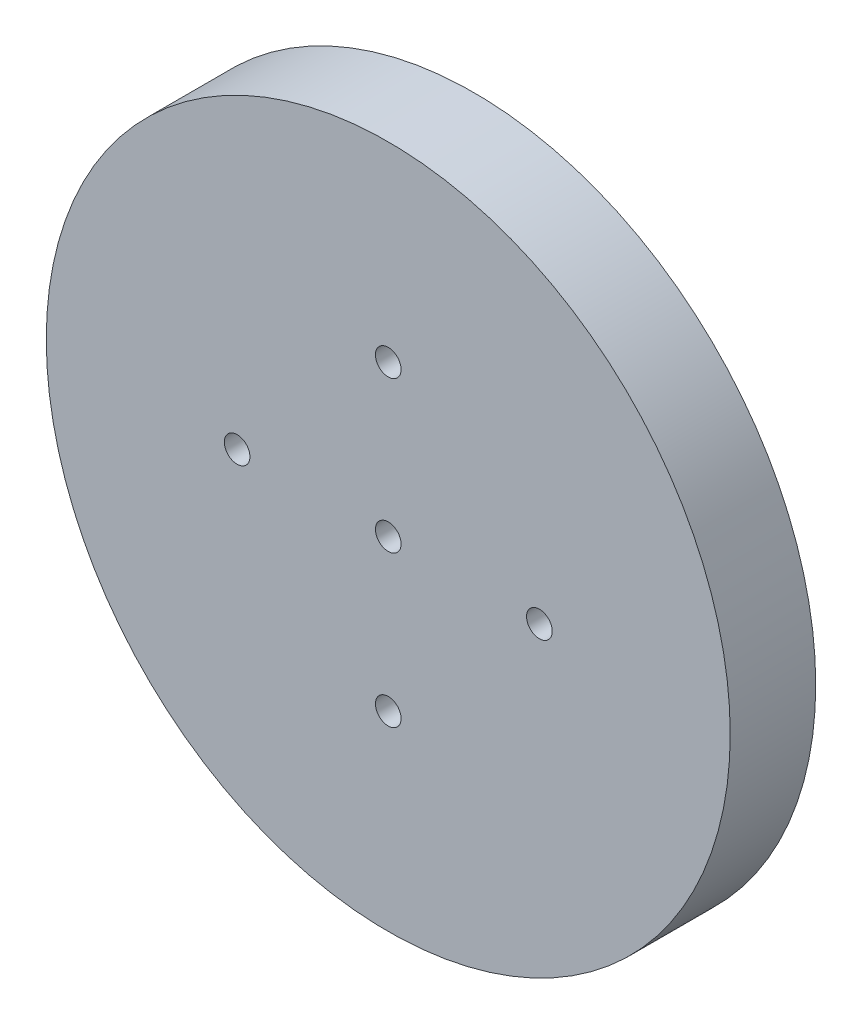
ISO-10303-21;
HEADER;
FILE_DESCRIPTION(('STEP AP214'),'2;1');
FILE_NAME('part.step','',(''),(''),'','','');
FILE_SCHEMA(('AUTOMOTIVE_DESIGN { 1 0 10303 214 1 1 1 1 }'));
ENDSEC;
DATA;
#1=APPLICATION_CONTEXT('core data for automotive mechanical design processes');
#2=APPLICATION_PROTOCOL_DEFINITION('international standard','automotive_design',2000,#1);
#3=PRODUCT_CONTEXT('',#1,'mechanical');
#4=PRODUCT('Part','Part','',(#3));
#5=PRODUCT_RELATED_PRODUCT_CATEGORY('part','',(#4));
#6=PRODUCT_DEFINITION_FORMATION('','',#4);
#7=PRODUCT_DEFINITION_CONTEXT('part definition',#1,'design');
#8=PRODUCT_DEFINITION('design','',#6,#7);
#9=PRODUCT_DEFINITION_SHAPE('','',#8);
#10=(LENGTH_UNIT() NAMED_UNIT(*) SI_UNIT(.MILLI.,.METRE.));
#11=(NAMED_UNIT(*) PLANE_ANGLE_UNIT() SI_UNIT($,.RADIAN.));
#12=(NAMED_UNIT(*) SI_UNIT($,.STERADIAN.) SOLID_ANGLE_UNIT());
#13=UNCERTAINTY_MEASURE_WITH_UNIT(LENGTH_MEASURE(1.E-05),#10,'distance_accuracy_value','');
#14=(GEOMETRIC_REPRESENTATION_CONTEXT(3) GLOBAL_UNCERTAINTY_ASSIGNED_CONTEXT((#13)) GLOBAL_UNIT_ASSIGNED_CONTEXT((#10,
#11,#12)) REPRESENTATION_CONTEXT('',''));
#15=CARTESIAN_POINT('',(0.,0.,0.));
#16=DIRECTION('',(0.,0.,1.));
#17=DIRECTION('',(1.,0.,0.));
#18=AXIS2_PLACEMENT_3D('',#15,#16,#17);
#19=CARTESIAN_POINT('',(0.,0.,10.));
#20=DIRECTION('',(0.,0.,-1.));
#21=DIRECTION('',(-1.,0.,0.));
#22=AXIS2_PLACEMENT_3D('',#19,#20,#21);
#23=CYLINDRICAL_SURFACE('',#22,40.);
#24=CARTESIAN_POINT('',(0.,0.,10.));
#25=DIRECTION('',(0.,0.,1.));
#26=DIRECTION('',(1.,0.,0.));
#27=AXIS2_PLACEMENT_3D('',#24,#25,#26);
#28=CIRCLE('',#27,40.);
#29=CARTESIAN_POINT('',(40.,0.,10.));
#30=VERTEX_POINT('',#29);
#31=EDGE_CURVE('E10',#30,#30,#28,.T.);
#32=ORIENTED_EDGE('',*,*,#31,.F.);
#33=EDGE_LOOP('',(#32));
#34=FACE_BOUND('',#33,.T.);
#35=CARTESIAN_POINT('',(0.,0.,0.));
#36=DIRECTION('',(0.,0.,1.));
#37=DIRECTION('',(1.,0.,0.));
#38=AXIS2_PLACEMENT_3D('',#35,#36,#37);
#39=CIRCLE('',#38,40.);
#40=CARTESIAN_POINT('',(40.,0.,0.));
#41=VERTEX_POINT('',#40);
#42=EDGE_CURVE('E47',#41,#41,#39,.T.);
#43=ORIENTED_EDGE('',*,*,#42,.T.);
#44=EDGE_LOOP('',(#43));
#45=FACE_BOUND('',#44,.T.);
#46=ADVANCED_FACE('F39',(#34,#45),#23,.T.);
#47=CARTESIAN_POINT('',(0.,0.,10.));
#48=DIRECTION('',(0.,0.,1.));
#49=DIRECTION('',(1.,0.,0.));
#50=AXIS2_PLACEMENT_3D('',#47,#48,#49);
#51=PLANE('',#50);
#52=CARTESIAN_POINT('',(0.,-17.6776695296638,10.));
#53=DIRECTION('',(0.,0.,1.));
#54=DIRECTION('',(1.,0.,0.));
#55=AXIS2_PLACEMENT_3D('',#52,#53,#54);
#56=CIRCLE('',#55,1.5);
#57=CARTESIAN_POINT('',(1.50000000000001,-17.6776695296638,10.));
#58=VERTEX_POINT('',#57);
#59=EDGE_CURVE('E64',#58,#58,#56,.T.);
#60=ORIENTED_EDGE('',*,*,#59,.F.);
#61=EDGE_LOOP('',(#60));
#62=FACE_BOUND('',#61,.T.);
#63=CARTESIAN_POINT('',(0.,0.,10.));
#64=DIRECTION('',(0.,0.,1.));
#65=DIRECTION('',(1.,0.,0.));
#66=AXIS2_PLACEMENT_3D('',#63,#64,#65);
#67=CIRCLE('',#66,1.5);
#68=CARTESIAN_POINT('',(1.5,0.,10.));
#69=VERTEX_POINT('',#68);
#70=EDGE_CURVE('E98',#69,#69,#67,.T.);
#71=ORIENTED_EDGE('',*,*,#70,.F.);
#72=EDGE_LOOP('',(#71));
#73=FACE_BOUND('',#72,.T.);
#74=CARTESIAN_POINT('',(-17.6776695296638,0.,10.));
#75=DIRECTION('',(0.,0.,1.));
#76=DIRECTION('',(1.,0.,0.));
#77=AXIS2_PLACEMENT_3D('',#74,#75,#76);
#78=CIRCLE('',#77,1.5);
#79=CARTESIAN_POINT('',(-16.1776695296638,0.,10.));
#80=VERTEX_POINT('',#79);
#81=EDGE_CURVE('E94',#80,#80,#78,.T.);
#82=ORIENTED_EDGE('',*,*,#81,.F.);
#83=EDGE_LOOP('',(#82));
#84=FACE_BOUND('',#83,.T.);
#85=CARTESIAN_POINT('',(0.,17.6776695296637,10.));
#86=DIRECTION('',(0.,0.,1.));
#87=DIRECTION('',(1.,0.,0.));
#88=AXIS2_PLACEMENT_3D('',#85,#86,#87);
#89=CIRCLE('',#88,1.5);
#90=CARTESIAN_POINT('',(1.50000000000001,17.6776695296637,10.));
#91=VERTEX_POINT('',#90);
#92=EDGE_CURVE('E89',#91,#91,#89,.T.);
#93=ORIENTED_EDGE('',*,*,#92,.F.);
#94=EDGE_LOOP('',(#93));
#95=FACE_BOUND('',#94,.T.);
#96=CARTESIAN_POINT('',(17.6776695296637,0.,10.));
#97=DIRECTION('',(0.,0.,1.));
#98=DIRECTION('',(1.,0.,0.));
#99=AXIS2_PLACEMENT_3D('',#96,#97,#98);
#100=CIRCLE('',#99,1.5);
#101=CARTESIAN_POINT('',(19.1776695296637,0.,10.));
#102=VERTEX_POINT('',#101);
#103=EDGE_CURVE('E93',#102,#102,#100,.T.);
#104=ORIENTED_EDGE('',*,*,#103,.F.);
#105=EDGE_LOOP('',(#104));
#106=FACE_BOUND('',#105,.T.);
#107=ORIENTED_EDGE('',*,*,#31,.T.);
#108=EDGE_LOOP('',(#107));
#109=FACE_BOUND('',#108,.T.);
#110=ADVANCED_FACE('F111',(#62,#73,#84,#95,#106,#109),#51,.T.);
#111=CARTESIAN_POINT('',(0.,0.,0.));
#112=DIRECTION('',(0.,0.,1.));
#113=DIRECTION('',(1.,0.,0.));
#114=AXIS2_PLACEMENT_3D('',#111,#112,#113);
#115=PLANE('',#114);
#116=CARTESIAN_POINT('',(0.,0.,0.));
#117=DIRECTION('',(0.,0.,-1.));
#118=DIRECTION('',(-1.,0.,0.));
#119=AXIS2_PLACEMENT_3D('',#116,#117,#118);
#120=CIRCLE('',#119,38.5);
#121=CARTESIAN_POINT('',(-38.5,0.,0.));
#122=VERTEX_POINT('',#121);
#123=EDGE_CURVE('E56',#122,#122,#120,.T.);
#124=ORIENTED_EDGE('',*,*,#123,.F.);
#125=EDGE_LOOP('',(#124));
#126=FACE_BOUND('',#125,.T.);
#127=ORIENTED_EDGE('',*,*,#42,.F.);
#128=EDGE_LOOP('',(#127));
#129=FACE_BOUND('',#128,.T.);
#130=ADVANCED_FACE('F114',(#126,#129),#115,.F.);
#131=CARTESIAN_POINT('',(0.,0.,6.99999999999999));
#132=DIRECTION('',(0.,0.,-1.));
#133=DIRECTION('',(-1.,0.,0.));
#134=AXIS2_PLACEMENT_3D('',#131,#132,#133);
#135=CYLINDRICAL_SURFACE('',#134,38.5);
#136=CARTESIAN_POINT('',(0.,0.,6.99999999999999));
#137=DIRECTION('',(0.,0.,-1.));
#138=DIRECTION('',(-1.,0.,0.));
#139=AXIS2_PLACEMENT_3D('',#136,#137,#138);
#140=CIRCLE('',#139,38.5);
#141=CARTESIAN_POINT('',(-38.5,0.,6.99999999999999));
#142=VERTEX_POINT('',#141);
#143=EDGE_CURVE('E53',#142,#142,#140,.T.);
#144=ORIENTED_EDGE('',*,*,#143,.F.);
#145=EDGE_LOOP('',(#144));
#146=FACE_BOUND('',#145,.T.);
#147=ORIENTED_EDGE('',*,*,#123,.T.);
#148=EDGE_LOOP('',(#147));
#149=FACE_BOUND('',#148,.T.);
#150=ADVANCED_FACE('F137',(#146,#149),#135,.F.);
#151=CARTESIAN_POINT('',(0.,0.,6.99999999999999));
#152=DIRECTION('',(0.,0.,-1.));
#153=DIRECTION('',(-1.,0.,0.));
#154=AXIS2_PLACEMENT_3D('',#151,#152,#153);
#155=PLANE('',#154);
#156=CARTESIAN_POINT('',(0.,-17.6776695296638,6.99999999999999));
#157=DIRECTION('',(0.,0.,-1.));
#158=DIRECTION('',(-1.,0.,0.));
#159=AXIS2_PLACEMENT_3D('',#156,#157,#158);
#160=CIRCLE('',#159,1.5);
#161=CARTESIAN_POINT('',(-1.49999999999999,-17.6776695296638,6.99999999999999));
#162=VERTEX_POINT('',#161);
#163=EDGE_CURVE('E42',#162,#162,#160,.T.);
#164=ORIENTED_EDGE('',*,*,#163,.F.);
#165=EDGE_LOOP('',(#164));
#166=FACE_BOUND('',#165,.T.);
#167=CARTESIAN_POINT('',(0.,0.,6.99999999999999));
#168=DIRECTION('',(0.,0.,-1.));
#169=DIRECTION('',(-1.,0.,0.));
#170=AXIS2_PLACEMENT_3D('',#167,#168,#169);
#171=CIRCLE('',#170,1.5);
#172=CARTESIAN_POINT('',(-1.5,0.,6.99999999999999));
#173=VERTEX_POINT('',#172);
#174=EDGE_CURVE('E71',#173,#173,#171,.T.);
#175=ORIENTED_EDGE('',*,*,#174,.F.);
#176=EDGE_LOOP('',(#175));
#177=FACE_BOUND('',#176,.T.);
#178=CARTESIAN_POINT('',(-17.6776695296638,0.,6.99999999999999));
#179=DIRECTION('',(0.,0.,-1.));
#180=DIRECTION('',(-1.,0.,0.));
#181=AXIS2_PLACEMENT_3D('',#178,#179,#180);
#182=CIRCLE('',#181,1.5);
#183=CARTESIAN_POINT('',(-19.1776695296638,0.,6.99999999999999));
#184=VERTEX_POINT('',#183);
#185=EDGE_CURVE('E68',#184,#184,#182,.T.);
#186=ORIENTED_EDGE('',*,*,#185,.F.);
#187=EDGE_LOOP('',(#186));
#188=FACE_BOUND('',#187,.T.);
#189=CARTESIAN_POINT('',(0.,17.6776695296637,6.99999999999999));
#190=DIRECTION('',(0.,0.,-1.));
#191=DIRECTION('',(-1.,0.,0.));
#192=AXIS2_PLACEMENT_3D('',#189,#190,#191);
#193=CIRCLE('',#192,1.5);
#194=CARTESIAN_POINT('',(-1.5,17.6776695296637,6.99999999999999));
#195=VERTEX_POINT('',#194);
#196=EDGE_CURVE('E63',#195,#195,#193,.T.);
#197=ORIENTED_EDGE('',*,*,#196,.F.);
#198=EDGE_LOOP('',(#197));
#199=FACE_BOUND('',#198,.T.);
#200=CARTESIAN_POINT('',(17.6776695296637,0.,6.99999999999999));
#201=DIRECTION('',(0.,0.,-1.));
#202=DIRECTION('',(-1.,0.,0.));
#203=AXIS2_PLACEMENT_3D('',#200,#201,#202);
#204=CIRCLE('',#203,1.5);
#205=CARTESIAN_POINT('',(16.1776695296637,0.,6.99999999999999));
#206=VERTEX_POINT('',#205);
#207=EDGE_CURVE('E59',#206,#206,#204,.T.);
#208=ORIENTED_EDGE('',*,*,#207,.F.);
#209=EDGE_LOOP('',(#208));
#210=FACE_BOUND('',#209,.T.);
#211=ORIENTED_EDGE('',*,*,#143,.T.);
#212=EDGE_LOOP('',(#211));
#213=FACE_BOUND('',#212,.T.);
#214=ADVANCED_FACE('F127',(#166,#177,#188,#199,#210,#213),#155,.T.);
#215=CARTESIAN_POINT('',(17.6776695296637,0.,0.));
#216=DIRECTION('',(0.,0.,1.));
#217=DIRECTION('',(1.,0.,0.));
#218=AXIS2_PLACEMENT_3D('',#215,#216,#217);
#219=CYLINDRICAL_SURFACE('',#218,1.5);
#220=ORIENTED_EDGE('',*,*,#207,.T.);
#221=EDGE_LOOP('',(#220));
#222=FACE_BOUND('',#221,.T.);
#223=ORIENTED_EDGE('',*,*,#103,.T.);
#224=EDGE_LOOP('',(#223));
#225=FACE_BOUND('',#224,.T.);
#226=ADVANCED_FACE('F124',(#222,#225),#219,.F.);
#227=CARTESIAN_POINT('',(0.,17.6776695296637,0.));
#228=DIRECTION('',(0.,0.,1.));
#229=DIRECTION('',(1.,0.,0.));
#230=AXIS2_PLACEMENT_3D('',#227,#228,#229);
#231=CYLINDRICAL_SURFACE('',#230,1.5);
#232=ORIENTED_EDGE('',*,*,#196,.T.);
#233=EDGE_LOOP('',(#232));
#234=FACE_BOUND('',#233,.T.);
#235=ORIENTED_EDGE('',*,*,#92,.T.);
#236=EDGE_LOOP('',(#235));
#237=FACE_BOUND('',#236,.T.);
#238=ADVANCED_FACE('F126',(#234,#237),#231,.F.);
#239=CARTESIAN_POINT('',(-17.6776695296638,0.,0.));
#240=DIRECTION('',(0.,0.,1.));
#241=DIRECTION('',(1.,0.,0.));
#242=AXIS2_PLACEMENT_3D('',#239,#240,#241);
#243=CYLINDRICAL_SURFACE('',#242,1.5);
#244=ORIENTED_EDGE('',*,*,#185,.T.);
#245=EDGE_LOOP('',(#244));
#246=FACE_BOUND('',#245,.T.);
#247=ORIENTED_EDGE('',*,*,#81,.T.);
#248=EDGE_LOOP('',(#247));
#249=FACE_BOUND('',#248,.T.);
#250=ADVANCED_FACE('F134',(#246,#249),#243,.F.);
#251=CARTESIAN_POINT('',(0.,0.,0.));
#252=DIRECTION('',(0.,0.,1.));
#253=DIRECTION('',(1.,0.,0.));
#254=AXIS2_PLACEMENT_3D('',#251,#252,#253);
#255=CYLINDRICAL_SURFACE('',#254,1.5);
#256=ORIENTED_EDGE('',*,*,#174,.T.);
#257=EDGE_LOOP('',(#256));
#258=FACE_BOUND('',#257,.T.);
#259=ORIENTED_EDGE('',*,*,#70,.T.);
#260=EDGE_LOOP('',(#259));
#261=FACE_BOUND('',#260,.T.);
#262=ADVANCED_FACE('F199',(#258,#261),#255,.F.);
#263=CARTESIAN_POINT('',(0.,-17.6776695296638,0.));
#264=DIRECTION('',(0.,0.,1.));
#265=DIRECTION('',(1.,0.,0.));
#266=AXIS2_PLACEMENT_3D('',#263,#264,#265);
#267=CYLINDRICAL_SURFACE('',#266,1.5);
#268=ORIENTED_EDGE('',*,*,#163,.T.);
#269=EDGE_LOOP('',(#268));
#270=FACE_BOUND('',#269,.T.);
#271=ORIENTED_EDGE('',*,*,#59,.T.);
#272=EDGE_LOOP('',(#271));
#273=FACE_BOUND('',#272,.T.);
#274=ADVANCED_FACE('F109',(#270,#273),#267,.F.);
#275=CLOSED_SHELL('',(#46,#110,#130,#150,#214,#226,#238,#250,#262,#274));
#276=MANIFOLD_SOLID_BREP('B2',#275);
#277=ADVANCED_BREP_SHAPE_REPRESENTATION('',(#18,#276),#14);
#278=SHAPE_DEFINITION_REPRESENTATION(#9,#277);
ENDSEC;
END-ISO-10303-21;
